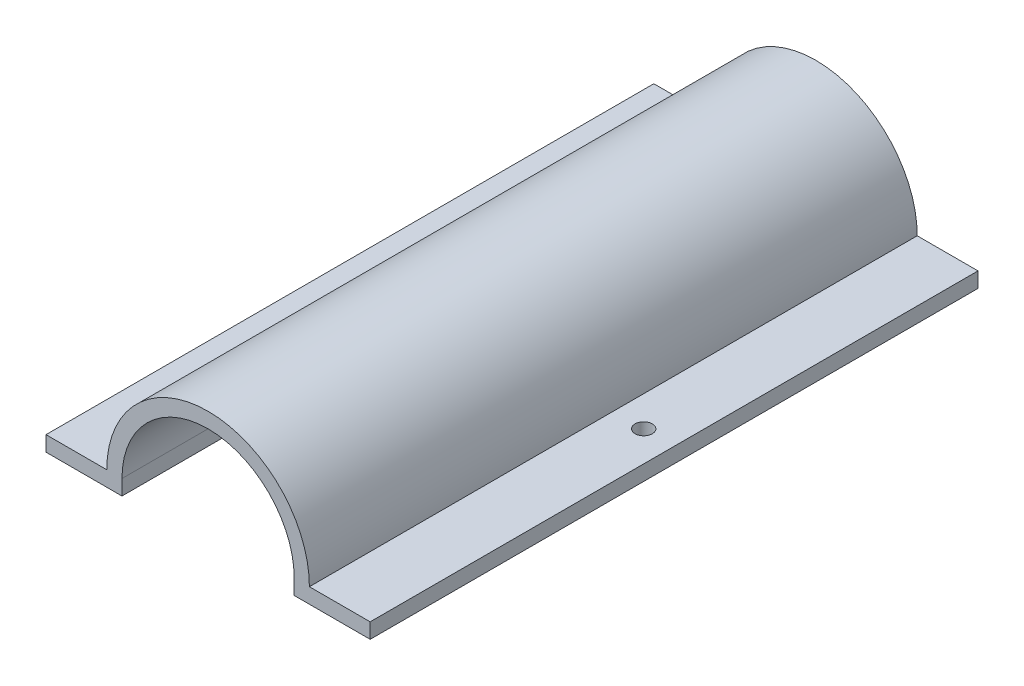
ISO-10303-21;
HEADER;
FILE_DESCRIPTION(('STEP AP214'),'2;1');
FILE_NAME('part.step','',(''),(''),'','','');
FILE_SCHEMA(('AUTOMOTIVE_DESIGN { 1 0 10303 214 1 1 1 1 }'));
ENDSEC;
DATA;
#1=APPLICATION_CONTEXT('core data for automotive mechanical design processes');
#2=APPLICATION_PROTOCOL_DEFINITION('international standard','automotive_design',2000,#1);
#3=PRODUCT_CONTEXT('',#1,'mechanical');
#4=PRODUCT('Part','Part','',(#3));
#5=PRODUCT_RELATED_PRODUCT_CATEGORY('part','',(#4));
#6=PRODUCT_DEFINITION_FORMATION('','',#4);
#7=PRODUCT_DEFINITION_CONTEXT('part definition',#1,'design');
#8=PRODUCT_DEFINITION('design','',#6,#7);
#9=PRODUCT_DEFINITION_SHAPE('','',#8);
#10=(LENGTH_UNIT() NAMED_UNIT(*) SI_UNIT(.MILLI.,.METRE.));
#11=(NAMED_UNIT(*) PLANE_ANGLE_UNIT() SI_UNIT($,.RADIAN.));
#12=(NAMED_UNIT(*) SI_UNIT($,.STERADIAN.) SOLID_ANGLE_UNIT());
#13=UNCERTAINTY_MEASURE_WITH_UNIT(LENGTH_MEASURE(1.E-05),#10,'distance_accuracy_value','');
#14=(GEOMETRIC_REPRESENTATION_CONTEXT(3) GLOBAL_UNCERTAINTY_ASSIGNED_CONTEXT((#13)) GLOBAL_UNIT_ASSIGNED_CONTEXT((#10,
#11,#12)) REPRESENTATION_CONTEXT('',''));
#15=CARTESIAN_POINT('',(0.,0.,0.));
#16=DIRECTION('',(0.,0.,1.));
#17=DIRECTION('',(1.,0.,0.));
#18=AXIS2_PLACEMENT_3D('',#15,#16,#17);
#19=CARTESIAN_POINT('',(0.,3.,120.));
#20=DIRECTION('',(1.,0.,0.));
#21=DIRECTION('',(0.,1.,0.));
#22=AXIS2_PLACEMENT_3D('',#19,#20,#21);
#23=PLANE('',#22);
#24=DIRECTION('',(0.,-1.,0.));
#25=VECTOR('',#24,1.);
#26=CARTESIAN_POINT('',(0.,3.,0.));
#27=LINE('',#26,#25);
#28=CARTESIAN_POINT('',(0.,3.,0.));
#29=VERTEX_POINT('',#28);
#30=CARTESIAN_POINT('',(0.,0.,0.));
#31=VERTEX_POINT('',#30);
#32=EDGE_CURVE('E142',#29,#31,#27,.T.);
#33=ORIENTED_EDGE('',*,*,#32,.T.);
#34=DIRECTION('',(0.,0.,-1.));
#35=VECTOR('',#34,1.);
#36=CARTESIAN_POINT('',(0.,0.,120.));
#37=LINE('',#36,#35);
#38=CARTESIAN_POINT('',(0.,0.,120.));
#39=VERTEX_POINT('',#38);
#40=EDGE_CURVE('E11',#39,#31,#37,.T.);
#41=ORIENTED_EDGE('',*,*,#40,.F.);
#42=DIRECTION('',(0.,-1.,0.));
#43=VECTOR('',#42,1.);
#44=CARTESIAN_POINT('',(0.,3.,120.));
#45=LINE('',#44,#43);
#46=CARTESIAN_POINT('',(0.,3.,120.));
#47=VERTEX_POINT('',#46);
#48=EDGE_CURVE('E161',#47,#39,#45,.T.);
#49=ORIENTED_EDGE('',*,*,#48,.F.);
#50=DIRECTION('',(0.,0.,-1.));
#51=VECTOR('',#50,1.);
#52=CARTESIAN_POINT('',(0.,3.,120.));
#53=LINE('',#52,#51);
#54=EDGE_CURVE('E138',#47,#29,#53,.T.);
#55=ORIENTED_EDGE('',*,*,#54,.T.);
#56=EDGE_LOOP('',(#33,#41,#49,#55));
#57=FACE_BOUND('',#56,.T.);
#58=ADVANCED_FACE('F34',(#57),#23,.F.);
#59=CARTESIAN_POINT('',(0.,0.,120.));
#60=DIRECTION('',(0.,1.,0.));
#61=DIRECTION('',(-1.,0.,0.));
#62=AXIS2_PLACEMENT_3D('',#59,#60,#61);
#63=PLANE('',#62);
#64=CARTESIAN_POINT('',(6.,0.,60.));
#65=DIRECTION('',(0.,1.,0.));
#66=DIRECTION('',(-1.,0.,0.));
#67=AXIS2_PLACEMENT_3D('',#64,#65,#66);
#68=CIRCLE('',#67,1.7);
#69=CARTESIAN_POINT('',(4.3,0.,60.));
#70=VERTEX_POINT('',#69);
#71=EDGE_CURVE('E146',#70,#70,#68,.T.);
#72=ORIENTED_EDGE('',*,*,#71,.T.);
#73=EDGE_LOOP('',(#72));
#74=FACE_BOUND('',#73,.T.);
#75=DIRECTION('',(1.,0.,0.));
#76=VECTOR('',#75,1.);
#77=CARTESIAN_POINT('',(0.,0.,0.));
#78=LINE('',#77,#76);
#79=CARTESIAN_POINT('',(15.,0.,0.));
#80=VERTEX_POINT('',#79);
#81=EDGE_CURVE('E145',#31,#80,#78,.T.);
#82=ORIENTED_EDGE('',*,*,#81,.T.);
#83=DIRECTION('',(0.,0.,-1.));
#84=VECTOR('',#83,1.);
#85=CARTESIAN_POINT('',(15.,0.,120.));
#86=LINE('',#85,#84);
#87=CARTESIAN_POINT('',(15.,0.,120.));
#88=VERTEX_POINT('',#87);
#89=EDGE_CURVE('E42',#88,#80,#86,.T.);
#90=ORIENTED_EDGE('',*,*,#89,.F.);
#91=DIRECTION('',(1.,0.,0.));
#92=VECTOR('',#91,1.);
#93=CARTESIAN_POINT('',(0.,0.,120.));
#94=LINE('',#93,#92);
#95=EDGE_CURVE('E99',#39,#88,#94,.T.);
#96=ORIENTED_EDGE('',*,*,#95,.F.);
#97=ORIENTED_EDGE('',*,*,#40,.T.);
#98=EDGE_LOOP('',(#82,#90,#96,#97));
#99=FACE_BOUND('',#98,.T.);
#100=ADVANCED_FACE('F236',(#74,#99),#63,.F.);
#101=CARTESIAN_POINT('',(15.,3.,120.));
#102=DIRECTION('',(-1.,0.,0.));
#103=DIRECTION('',(0.,0.,1.));
#104=AXIS2_PLACEMENT_3D('',#101,#102,#103);
#105=PLANE('',#104);
#106=DIRECTION('',(0.,1.,0.));
#107=VECTOR('',#106,1.);
#108=CARTESIAN_POINT('',(15.,3.,0.));
#109=LINE('',#108,#107);
#110=CARTESIAN_POINT('',(15.,3.,0.));
#111=VERTEX_POINT('',#110);
#112=EDGE_CURVE('E148',#80,#111,#109,.T.);
#113=ORIENTED_EDGE('',*,*,#112,.T.);
#114=DIRECTION('',(0.,0.,-1.));
#115=VECTOR('',#114,1.);
#116=CARTESIAN_POINT('',(15.,3.,120.));
#117=LINE('',#116,#115);
#118=CARTESIAN_POINT('',(15.,3.,120.));
#119=VERTEX_POINT('',#118);
#120=EDGE_CURVE('E174',#119,#111,#117,.T.);
#121=ORIENTED_EDGE('',*,*,#120,.F.);
#122=DIRECTION('',(0.,1.,0.));
#123=VECTOR('',#122,1.);
#124=CARTESIAN_POINT('',(15.,3.,120.));
#125=LINE('',#124,#123);
#126=EDGE_CURVE('E182',#88,#119,#125,.T.);
#127=ORIENTED_EDGE('',*,*,#126,.F.);
#128=ORIENTED_EDGE('',*,*,#89,.T.);
#129=EDGE_LOOP('',(#113,#121,#127,#128));
#130=FACE_BOUND('',#129,.T.);
#131=ADVANCED_FACE('F180',(#130),#105,.F.);
#132=CARTESIAN_POINT('',(32.,3.00000000000001,120.));
#133=DIRECTION('',(0.,0.,-1.));
#134=DIRECTION('',(-1.,0.,0.));
#135=AXIS2_PLACEMENT_3D('',#132,#133,#134);
#136=CYLINDRICAL_SURFACE('',#135,17.);
#137=CARTESIAN_POINT('',(32.,3.00000000000001,0.));
#138=DIRECTION('',(0.,0.,-1.));
#139=DIRECTION('',(1.,0.,0.));
#140=AXIS2_PLACEMENT_3D('',#137,#138,#139);
#141=CIRCLE('',#140,17.);
#142=CARTESIAN_POINT('',(49.,3.00000000000001,0.));
#143=VERTEX_POINT('',#142);
#144=EDGE_CURVE('E150',#111,#143,#141,.T.);
#145=ORIENTED_EDGE('',*,*,#144,.T.);
#146=DIRECTION('',(0.,0.,-1.));
#147=VECTOR('',#146,1.);
#148=CARTESIAN_POINT('',(49.,3.00000000000001,120.));
#149=LINE('',#148,#147);
#150=CARTESIAN_POINT('',(49.,3.00000000000001,120.));
#151=VERTEX_POINT('',#150);
#152=EDGE_CURVE('E171',#151,#143,#149,.T.);
#153=ORIENTED_EDGE('',*,*,#152,.F.);
#154=CARTESIAN_POINT('',(32.,3.00000000000001,120.));
#155=DIRECTION('',(0.,0.,-1.));
#156=DIRECTION('',(1.,0.,0.));
#157=AXIS2_PLACEMENT_3D('',#154,#155,#156);
#158=CIRCLE('',#157,17.);
#159=EDGE_CURVE('E200',#119,#151,#158,.T.);
#160=ORIENTED_EDGE('',*,*,#159,.F.);
#161=ORIENTED_EDGE('',*,*,#120,.T.);
#162=EDGE_LOOP('',(#145,#153,#160,#161));
#163=FACE_BOUND('',#162,.T.);
#164=ADVANCED_FACE('F191',(#163),#136,.F.);
#165=CARTESIAN_POINT('',(49.,3.00000000000001,120.));
#166=DIRECTION('',(1.,0.,0.));
#167=DIRECTION('',(0.,0.,-1.));
#168=AXIS2_PLACEMENT_3D('',#165,#166,#167);
#169=PLANE('',#168);
#170=DIRECTION('',(0.,-1.,0.));
#171=VECTOR('',#170,1.);
#172=CARTESIAN_POINT('',(49.,3.00000000000001,0.));
#173=LINE('',#172,#171);
#174=CARTESIAN_POINT('',(49.,0.,0.));
#175=VERTEX_POINT('',#174);
#176=EDGE_CURVE('E152',#143,#175,#173,.T.);
#177=ORIENTED_EDGE('',*,*,#176,.T.);
#178=DIRECTION('',(0.,0.,-1.));
#179=VECTOR('',#178,1.);
#180=CARTESIAN_POINT('',(49.,0.,120.));
#181=LINE('',#180,#179);
#182=CARTESIAN_POINT('',(49.,0.,120.));
#183=VERTEX_POINT('',#182);
#184=EDGE_CURVE('E168',#183,#175,#181,.T.);
#185=ORIENTED_EDGE('',*,*,#184,.F.);
#186=DIRECTION('',(0.,-1.,0.));
#187=VECTOR('',#186,1.);
#188=CARTESIAN_POINT('',(49.,3.00000000000001,120.));
#189=LINE('',#188,#187);
#190=EDGE_CURVE('E197',#151,#183,#189,.T.);
#191=ORIENTED_EDGE('',*,*,#190,.F.);
#192=ORIENTED_EDGE('',*,*,#152,.T.);
#193=EDGE_LOOP('',(#177,#185,#191,#192));
#194=FACE_BOUND('',#193,.T.);
#195=ADVANCED_FACE('F195',(#194),#169,.F.);
#196=CARTESIAN_POINT('',(49.,0.,120.));
#197=DIRECTION('',(0.,1.,0.));
#198=DIRECTION('',(0.,0.,1.));
#199=AXIS2_PLACEMENT_3D('',#196,#197,#198);
#200=PLANE('',#199);
#201=CARTESIAN_POINT('',(58.,0.,60.));
#202=DIRECTION('',(0.,1.,0.));
#203=DIRECTION('',(0.,0.,1.));
#204=AXIS2_PLACEMENT_3D('',#201,#202,#203);
#205=CIRCLE('',#204,1.7);
#206=CARTESIAN_POINT('',(58.,0.,61.7));
#207=VERTEX_POINT('',#206);
#208=EDGE_CURVE('E213',#207,#207,#205,.T.);
#209=ORIENTED_EDGE('',*,*,#208,.T.);
#210=EDGE_LOOP('',(#209));
#211=FACE_BOUND('',#210,.T.);
#212=DIRECTION('',(1.,0.,0.));
#213=VECTOR('',#212,1.);
#214=CARTESIAN_POINT('',(49.,0.,0.));
#215=LINE('',#214,#213);
#216=CARTESIAN_POINT('',(64.,0.,0.));
#217=VERTEX_POINT('',#216);
#218=EDGE_CURVE('E154',#175,#217,#215,.T.);
#219=ORIENTED_EDGE('',*,*,#218,.T.);
#220=DIRECTION('',(0.,0.,-1.));
#221=VECTOR('',#220,1.);
#222=CARTESIAN_POINT('',(64.,0.,120.));
#223=LINE('',#222,#221);
#224=CARTESIAN_POINT('',(64.,0.,120.));
#225=VERTEX_POINT('',#224);
#226=EDGE_CURVE('E165',#225,#217,#223,.T.);
#227=ORIENTED_EDGE('',*,*,#226,.F.);
#228=DIRECTION('',(1.,0.,0.));
#229=VECTOR('',#228,1.);
#230=CARTESIAN_POINT('',(49.,0.,120.));
#231=LINE('',#230,#229);
#232=EDGE_CURVE('E199',#183,#225,#231,.T.);
#233=ORIENTED_EDGE('',*,*,#232,.F.);
#234=ORIENTED_EDGE('',*,*,#184,.T.);
#235=EDGE_LOOP('',(#219,#227,#233,#234));
#236=FACE_BOUND('',#235,.T.);
#237=ADVANCED_FACE('F232',(#211,#236),#200,.F.);
#238=CARTESIAN_POINT('',(64.,0.,120.));
#239=DIRECTION('',(-1.,0.,0.));
#240=DIRECTION('',(0.,0.,1.));
#241=AXIS2_PLACEMENT_3D('',#238,#239,#240);
#242=PLANE('',#241);
#243=DIRECTION('',(0.,1.,0.));
#244=VECTOR('',#243,1.);
#245=CARTESIAN_POINT('',(64.,0.,0.));
#246=LINE('',#245,#244);
#247=CARTESIAN_POINT('',(64.,3.00000000000001,0.));
#248=VERTEX_POINT('',#247);
#249=EDGE_CURVE('E156',#217,#248,#246,.T.);
#250=ORIENTED_EDGE('',*,*,#249,.T.);
#251=DIRECTION('',(0.,0.,-1.));
#252=VECTOR('',#251,1.);
#253=CARTESIAN_POINT('',(64.,3.00000000000001,120.));
#254=LINE('',#253,#252);
#255=CARTESIAN_POINT('',(64.,3.00000000000001,120.));
#256=VERTEX_POINT('',#255);
#257=EDGE_CURVE('E133',#256,#248,#254,.T.);
#258=ORIENTED_EDGE('',*,*,#257,.F.);
#259=DIRECTION('',(0.,1.,0.));
#260=VECTOR('',#259,1.);
#261=CARTESIAN_POINT('',(64.,0.,120.));
#262=LINE('',#261,#260);
#263=EDGE_CURVE('E124',#225,#256,#262,.T.);
#264=ORIENTED_EDGE('',*,*,#263,.F.);
#265=ORIENTED_EDGE('',*,*,#226,.T.);
#266=EDGE_LOOP('',(#250,#258,#264,#265));
#267=FACE_BOUND('',#266,.T.);
#268=ADVANCED_FACE('F224',(#267),#242,.F.);
#269=CARTESIAN_POINT('',(64.,3.00000000000001,120.));
#270=DIRECTION('',(0.,-1.,0.));
#271=DIRECTION('',(1.,0.,0.));
#272=AXIS2_PLACEMENT_3D('',#269,#270,#271);
#273=PLANE('',#272);
#274=CARTESIAN_POINT('',(58.,3.00000000000001,60.));
#275=DIRECTION('',(0.,1.,0.));
#276=DIRECTION('',(0.,0.,1.));
#277=AXIS2_PLACEMENT_3D('',#274,#275,#276);
#278=CIRCLE('',#277,1.7);
#279=CARTESIAN_POINT('',(58.,3.00000000000001,61.7));
#280=VERTEX_POINT('',#279);
#281=EDGE_CURVE('E216',#280,#280,#278,.T.);
#282=ORIENTED_EDGE('',*,*,#281,.F.);
#283=EDGE_LOOP('',(#282));
#284=FACE_BOUND('',#283,.T.);
#285=DIRECTION('',(-1.,0.,0.));
#286=VECTOR('',#285,1.);
#287=CARTESIAN_POINT('',(64.,3.00000000000001,0.));
#288=LINE('',#287,#286);
#289=CARTESIAN_POINT('',(52.,3.00000000000001,0.));
#290=VERTEX_POINT('',#289);
#291=EDGE_CURVE('E132',#248,#290,#288,.T.);
#292=ORIENTED_EDGE('',*,*,#291,.T.);
#293=DIRECTION('',(0.,0.,-1.));
#294=VECTOR('',#293,1.);
#295=CARTESIAN_POINT('',(52.,3.00000000000001,120.));
#296=LINE('',#295,#294);
#297=CARTESIAN_POINT('',(52.,3.00000000000001,120.));
#298=VERTEX_POINT('',#297);
#299=EDGE_CURVE('E129',#298,#290,#296,.T.);
#300=ORIENTED_EDGE('',*,*,#299,.F.);
#301=DIRECTION('',(-1.,0.,0.));
#302=VECTOR('',#301,1.);
#303=CARTESIAN_POINT('',(64.,3.00000000000001,120.));
#304=LINE('',#303,#302);
#305=EDGE_CURVE('E118',#256,#298,#304,.T.);
#306=ORIENTED_EDGE('',*,*,#305,.F.);
#307=ORIENTED_EDGE('',*,*,#257,.T.);
#308=EDGE_LOOP('',(#292,#300,#306,#307));
#309=FACE_BOUND('',#308,.T.);
#310=ADVANCED_FACE('F130',(#284,#309),#273,.F.);
#311=CARTESIAN_POINT('',(32.,3.00000000000001,120.));
#312=DIRECTION('',(0.,0.,-1.));
#313=DIRECTION('',(-1.,0.,0.));
#314=AXIS2_PLACEMENT_3D('',#311,#312,#313);
#315=CYLINDRICAL_SURFACE('',#314,20.);
#316=CARTESIAN_POINT('',(32.,3.00000000000001,0.));
#317=DIRECTION('',(0.,0.,1.));
#318=DIRECTION('',(1.,0.,0.));
#319=AXIS2_PLACEMENT_3D('',#316,#317,#318);
#320=CIRCLE('',#319,20.);
#321=CARTESIAN_POINT('',(12.,3.00000000000001,0.));
#322=VERTEX_POINT('',#321);
#323=EDGE_CURVE('E85',#290,#322,#320,.T.);
#324=ORIENTED_EDGE('',*,*,#323,.T.);
#325=DIRECTION('',(0.,0.,-1.));
#326=VECTOR('',#325,1.);
#327=CARTESIAN_POINT('',(12.,3.00000000000001,120.));
#328=LINE('',#327,#326);
#329=CARTESIAN_POINT('',(12.,3.00000000000001,120.));
#330=VERTEX_POINT('',#329);
#331=EDGE_CURVE('E134',#330,#322,#328,.T.);
#332=ORIENTED_EDGE('',*,*,#331,.F.);
#333=CARTESIAN_POINT('',(32.,3.00000000000001,120.));
#334=DIRECTION('',(0.,0.,1.));
#335=DIRECTION('',(1.,0.,0.));
#336=AXIS2_PLACEMENT_3D('',#333,#334,#335);
#337=CIRCLE('',#336,20.);
#338=EDGE_CURVE('E122',#298,#330,#337,.T.);
#339=ORIENTED_EDGE('',*,*,#338,.F.);
#340=ORIENTED_EDGE('',*,*,#299,.T.);
#341=EDGE_LOOP('',(#324,#332,#339,#340));
#342=FACE_BOUND('',#341,.T.);
#343=ADVANCED_FACE('F136',(#342),#315,.T.);
#344=CARTESIAN_POINT('',(12.,3.,120.));
#345=DIRECTION('',(0.,-1.,0.));
#346=DIRECTION('',(1.,0.,0.));
#347=AXIS2_PLACEMENT_3D('',#344,#345,#346);
#348=PLANE('',#347);
#349=CARTESIAN_POINT('',(6.,3.,60.));
#350=DIRECTION('',(0.,1.,0.));
#351=DIRECTION('',(0.,0.,1.));
#352=AXIS2_PLACEMENT_3D('',#349,#350,#351);
#353=CIRCLE('',#352,1.7);
#354=CARTESIAN_POINT('',(6.,3.,61.7));
#355=VERTEX_POINT('',#354);
#356=EDGE_CURVE('E210',#355,#355,#353,.T.);
#357=ORIENTED_EDGE('',*,*,#356,.F.);
#358=EDGE_LOOP('',(#357));
#359=FACE_BOUND('',#358,.T.);
#360=DIRECTION('',(-1.,0.,0.));
#361=VECTOR('',#360,1.);
#362=CARTESIAN_POINT('',(12.,3.,0.));
#363=LINE('',#362,#361);
#364=EDGE_CURVE('E91',#322,#29,#363,.T.);
#365=ORIENTED_EDGE('',*,*,#364,.T.);
#366=ORIENTED_EDGE('',*,*,#54,.F.);
#367=DIRECTION('',(-1.,0.,0.));
#368=VECTOR('',#367,1.);
#369=CARTESIAN_POINT('',(12.,3.,120.));
#370=LINE('',#369,#368);
#371=EDGE_CURVE('E50',#330,#47,#370,.T.);
#372=ORIENTED_EDGE('',*,*,#371,.F.);
#373=ORIENTED_EDGE('',*,*,#331,.T.);
#374=EDGE_LOOP('',(#365,#366,#372,#373));
#375=FACE_BOUND('',#374,.T.);
#376=ADVANCED_FACE('F230',(#359,#375),#348,.F.);
#377=CARTESIAN_POINT('',(32.,3.00000000000001,120.));
#378=DIRECTION('',(0.,0.,1.));
#379=DIRECTION('',(1.,0.,0.));
#380=AXIS2_PLACEMENT_3D('',#377,#378,#379);
#381=PLANE('',#380);
#382=ORIENTED_EDGE('',*,*,#48,.T.);
#383=ORIENTED_EDGE('',*,*,#95,.T.);
#384=ORIENTED_EDGE('',*,*,#126,.T.);
#385=ORIENTED_EDGE('',*,*,#159,.T.);
#386=ORIENTED_EDGE('',*,*,#190,.T.);
#387=ORIENTED_EDGE('',*,*,#232,.T.);
#388=ORIENTED_EDGE('',*,*,#263,.T.);
#389=ORIENTED_EDGE('',*,*,#305,.T.);
#390=ORIENTED_EDGE('',*,*,#338,.T.);
#391=ORIENTED_EDGE('',*,*,#371,.T.);
#392=EDGE_LOOP('',(#382,#383,#384,#385,#386,#387,#388,#389,#390,#391));
#393=FACE_BOUND('',#392,.T.);
#394=ADVANCED_FACE('F120',(#393),#381,.T.);
#395=CARTESIAN_POINT('',(32.,3.00000000000001,0.));
#396=DIRECTION('',(0.,0.,1.));
#397=DIRECTION('',(1.,0.,0.));
#398=AXIS2_PLACEMENT_3D('',#395,#396,#397);
#399=PLANE('',#398);
#400=ORIENTED_EDGE('',*,*,#32,.F.);
#401=ORIENTED_EDGE('',*,*,#364,.F.);
#402=ORIENTED_EDGE('',*,*,#323,.F.);
#403=ORIENTED_EDGE('',*,*,#291,.F.);
#404=ORIENTED_EDGE('',*,*,#249,.F.);
#405=ORIENTED_EDGE('',*,*,#218,.F.);
#406=ORIENTED_EDGE('',*,*,#176,.F.);
#407=ORIENTED_EDGE('',*,*,#144,.F.);
#408=ORIENTED_EDGE('',*,*,#112,.F.);
#409=ORIENTED_EDGE('',*,*,#81,.F.);
#410=EDGE_LOOP('',(#400,#401,#402,#403,#404,#405,#406,#407,#408,#409));
#411=FACE_BOUND('',#410,.T.);
#412=ADVANCED_FACE('F186',(#411),#399,.F.);
#413=CARTESIAN_POINT('',(6.,3.,60.));
#414=DIRECTION('',(0.,1.,0.));
#415=DIRECTION('',(0.,0.,1.));
#416=AXIS2_PLACEMENT_3D('',#413,#414,#415);
#417=CYLINDRICAL_SURFACE('',#416,1.7);
#418=ORIENTED_EDGE('',*,*,#356,.T.);
#419=EDGE_LOOP('',(#418));
#420=FACE_BOUND('',#419,.T.);
#421=ORIENTED_EDGE('',*,*,#71,.F.);
#422=EDGE_LOOP('',(#421));
#423=FACE_BOUND('',#422,.T.);
#424=ADVANCED_FACE('F302',(#420,#423),#417,.F.);
#425=CARTESIAN_POINT('',(58.,3.00000000000001,60.));
#426=DIRECTION('',(0.,1.,0.));
#427=DIRECTION('',(0.,0.,1.));
#428=AXIS2_PLACEMENT_3D('',#425,#426,#427);
#429=CYLINDRICAL_SURFACE('',#428,1.7);
#430=ORIENTED_EDGE('',*,*,#281,.T.);
#431=EDGE_LOOP('',(#430));
#432=FACE_BOUND('',#431,.T.);
#433=ORIENTED_EDGE('',*,*,#208,.F.);
#434=EDGE_LOOP('',(#433));
#435=FACE_BOUND('',#434,.T.);
#436=ADVANCED_FACE('F220',(#432,#435),#429,.F.);
#437=CLOSED_SHELL('',(#58,#100,#131,#164,#195,#237,#268,#310,#343,#376,#394,#412,#424,#436));
#438=MANIFOLD_SOLID_BREP('B2',#437);
#439=ADVANCED_BREP_SHAPE_REPRESENTATION('',(#18,#438),#14);
#440=SHAPE_DEFINITION_REPRESENTATION(#9,#439);
ENDSEC;
END-ISO-10303-21;
